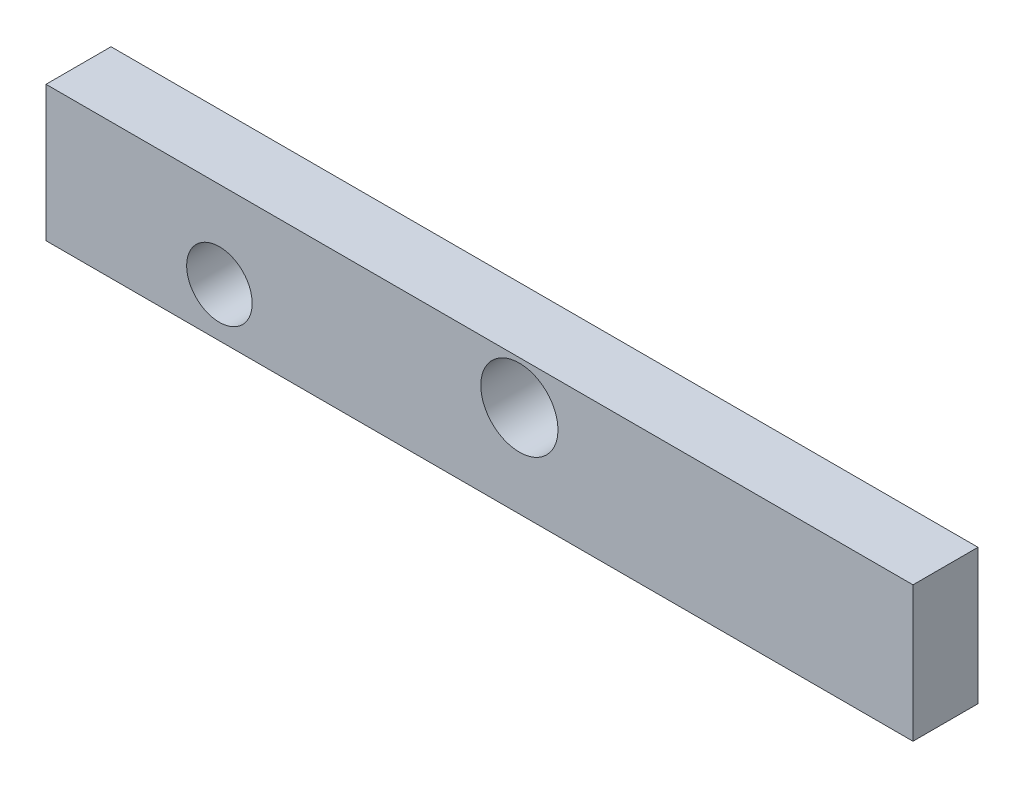
ISO-10303-21;
HEADER;
FILE_DESCRIPTION(('STEP AP214'),'2;1');
FILE_NAME('part.step','',(''),(''),'','','');
FILE_SCHEMA(('AUTOMOTIVE_DESIGN { 1 0 10303 214 1 1 1 1 }'));
ENDSEC;
DATA;
#1=APPLICATION_CONTEXT('core data for automotive mechanical design processes');
#2=APPLICATION_PROTOCOL_DEFINITION('international standard','automotive_design',2000,#1);
#3=PRODUCT_CONTEXT('',#1,'mechanical');
#4=PRODUCT('Part','Part','',(#3));
#5=PRODUCT_RELATED_PRODUCT_CATEGORY('part','',(#4));
#6=PRODUCT_DEFINITION_FORMATION('','',#4);
#7=PRODUCT_DEFINITION_CONTEXT('part definition',#1,'design');
#8=PRODUCT_DEFINITION('design','',#6,#7);
#9=PRODUCT_DEFINITION_SHAPE('','',#8);
#10=(LENGTH_UNIT() NAMED_UNIT(*) SI_UNIT(.MILLI.,.METRE.));
#11=(NAMED_UNIT(*) PLANE_ANGLE_UNIT() SI_UNIT($,.RADIAN.));
#12=(NAMED_UNIT(*) SI_UNIT($,.STERADIAN.) SOLID_ANGLE_UNIT());
#13=UNCERTAINTY_MEASURE_WITH_UNIT(LENGTH_MEASURE(1.E-05),#10,'distance_accuracy_value','');
#14=(GEOMETRIC_REPRESENTATION_CONTEXT(3) GLOBAL_UNCERTAINTY_ASSIGNED_CONTEXT((#13)) GLOBAL_UNIT_ASSIGNED_CONTEXT((#10,
#11,#12)) REPRESENTATION_CONTEXT('',''));
#15=CARTESIAN_POINT('',(0.,0.,0.));
#16=DIRECTION('',(0.,0.,1.));
#17=DIRECTION('',(1.,0.,0.));
#18=AXIS2_PLACEMENT_3D('',#15,#16,#17);
#19=CARTESIAN_POINT('',(-63.5,-22.225,9.525));
#20=DIRECTION('',(1.,0.,0.));
#21=DIRECTION('',(0.,0.,-1.));
#22=AXIS2_PLACEMENT_3D('',#19,#20,#21);
#23=PLANE('',#22);
#24=DIRECTION('',(0.,-1.,0.));
#25=VECTOR('',#24,1.);
#26=CARTESIAN_POINT('',(-63.5,-22.225,0.));
#27=LINE('',#26,#25);
#28=CARTESIAN_POINT('',(-63.5,22.225,0.));
#29=VERTEX_POINT('',#28);
#30=CARTESIAN_POINT('',(-63.5,2.3765268854373,0.));
#31=VERTEX_POINT('',#30);
#32=EDGE_CURVE('E87',#29,#31,#27,.T.);
#33=ORIENTED_EDGE('',*,*,#32,.T.);
#34=DIRECTION('',(0.,0.,-1.));
#35=VECTOR('',#34,1.);
#36=CARTESIAN_POINT('',(-63.5,2.3765268854373,9.525));
#37=LINE('',#36,#35);
#38=CARTESIAN_POINT('',(-63.5,2.3765268854373,9.525));
#39=VERTEX_POINT('',#38);
#40=EDGE_CURVE('E53',#39,#31,#37,.T.);
#41=ORIENTED_EDGE('',*,*,#40,.F.);
#42=DIRECTION('',(0.,-1.,0.));
#43=VECTOR('',#42,1.);
#44=CARTESIAN_POINT('',(-63.5,-22.225,9.525));
#45=LINE('',#44,#43);
#46=CARTESIAN_POINT('',(-63.5,22.225,9.525));
#47=VERTEX_POINT('',#46);
#48=EDGE_CURVE('E82',#47,#39,#45,.T.);
#49=ORIENTED_EDGE('',*,*,#48,.F.);
#50=DIRECTION('',(0.,0.,-1.));
#51=VECTOR('',#50,1.);
#52=CARTESIAN_POINT('',(-63.5,22.225,9.525));
#53=LINE('',#52,#51);
#54=EDGE_CURVE('E46',#47,#29,#53,.T.);
#55=ORIENTED_EDGE('',*,*,#54,.T.);
#56=EDGE_LOOP('',(#33,#41,#49,#55));
#57=FACE_BOUND('',#56,.T.);
#58=ADVANCED_FACE('F39',(#57),#23,.F.);
#59=CARTESIAN_POINT('',(63.5,-22.225,9.525));
#60=DIRECTION('',(-1.,0.,0.));
#61=DIRECTION('',(0.,0.,1.));
#62=AXIS2_PLACEMENT_3D('',#59,#60,#61);
#63=PLANE('',#62);
#64=DIRECTION('',(0.,1.,0.));
#65=VECTOR('',#64,1.);
#66=CARTESIAN_POINT('',(63.5,-22.225,9.525));
#67=LINE('',#66,#65);
#68=CARTESIAN_POINT('',(63.5,2.3765268854373,9.525));
#69=VERTEX_POINT('',#68);
#70=CARTESIAN_POINT('',(63.5,22.225,9.525));
#71=VERTEX_POINT('',#70);
#72=EDGE_CURVE('E98',#69,#71,#67,.T.);
#73=ORIENTED_EDGE('',*,*,#72,.F.);
#74=DIRECTION('',(0.,0.,-1.));
#75=VECTOR('',#74,1.);
#76=CARTESIAN_POINT('',(63.5,2.3765268854373,9.525));
#77=LINE('',#76,#75);
#78=CARTESIAN_POINT('',(63.5,2.3765268854373,0.));
#79=VERTEX_POINT('',#78);
#80=EDGE_CURVE('E102',#69,#79,#77,.T.);
#81=ORIENTED_EDGE('',*,*,#80,.T.);
#82=DIRECTION('',(0.,1.,0.));
#83=VECTOR('',#82,1.);
#84=CARTESIAN_POINT('',(63.5,-22.225,0.));
#85=LINE('',#84,#83);
#86=CARTESIAN_POINT('',(63.5,22.225,0.));
#87=VERTEX_POINT('',#86);
#88=EDGE_CURVE('E83',#79,#87,#85,.T.);
#89=ORIENTED_EDGE('',*,*,#88,.T.);
#90=DIRECTION('',(0.,0.,-1.));
#91=VECTOR('',#90,1.);
#92=CARTESIAN_POINT('',(63.5,22.225,9.525));
#93=LINE('',#92,#91);
#94=EDGE_CURVE('E11',#71,#87,#93,.T.);
#95=ORIENTED_EDGE('',*,*,#94,.F.);
#96=EDGE_LOOP('',(#73,#81,#89,#95));
#97=FACE_BOUND('',#96,.T.);
#98=ADVANCED_FACE('F143',(#97),#63,.F.);
#99=CARTESIAN_POINT('',(63.5,22.225,9.525));
#100=DIRECTION('',(0.,-1.,0.));
#101=DIRECTION('',(1.,0.,0.));
#102=AXIS2_PLACEMENT_3D('',#99,#100,#101);
#103=PLANE('',#102);
#104=DIRECTION('',(-1.,0.,0.));
#105=VECTOR('',#104,1.);
#106=CARTESIAN_POINT('',(63.5,22.225,0.));
#107=LINE('',#106,#105);
#108=EDGE_CURVE('E74',#87,#29,#107,.T.);
#109=ORIENTED_EDGE('',*,*,#108,.T.);
#110=ORIENTED_EDGE('',*,*,#54,.F.);
#111=DIRECTION('',(-1.,0.,0.));
#112=VECTOR('',#111,1.);
#113=CARTESIAN_POINT('',(63.5,22.225,9.525));
#114=LINE('',#113,#112);
#115=EDGE_CURVE('E62',#71,#47,#114,.T.);
#116=ORIENTED_EDGE('',*,*,#115,.F.);
#117=ORIENTED_EDGE('',*,*,#94,.T.);
#118=EDGE_LOOP('',(#109,#110,#116,#117));
#119=FACE_BOUND('',#118,.T.);
#120=ADVANCED_FACE('F76',(#119),#103,.F.);
#121=CARTESIAN_POINT('',(0.,0.,9.525));
#122=DIRECTION('',(0.,0.,1.));
#123=DIRECTION('',(1.,0.,0.));
#124=AXIS2_PLACEMENT_3D('',#121,#122,#123);
#125=PLANE('',#124);
#126=CARTESIAN_POINT('',(5.842,15.875,9.525));
#127=DIRECTION('',(0.,0.,-1.));
#128=DIRECTION('',(-1.,0.,0.));
#129=AXIS2_PLACEMENT_3D('',#126,#127,#128);
#130=CIRCLE('',#129,5.65212182349559);
#131=CARTESIAN_POINT('',(0.189878176504406,15.875,9.525));
#132=VERTEX_POINT('',#131);
#133=EDGE_CURVE('E109',#132,#132,#130,.T.);
#134=ORIENTED_EDGE('',*,*,#133,.T.);
#135=EDGE_LOOP('',(#134));
#136=FACE_BOUND('',#135,.T.);
#137=DIRECTION('',(1.,0.,0.));
#138=VECTOR('',#137,1.);
#139=CARTESIAN_POINT('',(63.5,2.3765268854373,9.525));
#140=LINE('',#139,#138);
#141=EDGE_CURVE('E105',#39,#69,#140,.T.);
#142=ORIENTED_EDGE('',*,*,#141,.T.);
#143=ORIENTED_EDGE('',*,*,#72,.T.);
#144=ORIENTED_EDGE('',*,*,#115,.T.);
#145=ORIENTED_EDGE('',*,*,#48,.T.);
#146=EDGE_LOOP('',(#142,#143,#144,#145));
#147=FACE_BOUND('',#146,.T.);
#148=CARTESIAN_POINT('',(-38.1,9.52500000000001,9.525));
#149=DIRECTION('',(0.,0.,1.));
#150=DIRECTION('',(1.,0.,0.));
#151=AXIS2_PLACEMENT_3D('',#148,#149,#150);
#152=CIRCLE('',#151,4.8);
#153=CARTESIAN_POINT('',(-42.9,9.52500000000001,9.525));
#154=VERTEX_POINT('',#153);
#155=EDGE_CURVE('E90',#154,#154,#152,.T.);
#156=ORIENTED_EDGE('',*,*,#155,.F.);
#157=EDGE_LOOP('',(#156));
#158=FACE_BOUND('',#157,.T.);
#159=ADVANCED_FACE('F118',(#136,#147,#158),#125,.T.);
#160=CARTESIAN_POINT('',(0.,0.,0.));
#161=DIRECTION('',(0.,0.,1.));
#162=DIRECTION('',(1.,0.,0.));
#163=AXIS2_PLACEMENT_3D('',#160,#161,#162);
#164=PLANE('',#163);
#165=CARTESIAN_POINT('',(5.842,15.875,0.));
#166=DIRECTION('',(0.,0.,-1.));
#167=DIRECTION('',(-1.,0.,0.));
#168=AXIS2_PLACEMENT_3D('',#165,#166,#167);
#169=CIRCLE('',#168,5.65212182349559);
#170=CARTESIAN_POINT('',(0.189878176504406,15.875,0.));
#171=VERTEX_POINT('',#170);
#172=EDGE_CURVE('E112',#171,#171,#169,.T.);
#173=ORIENTED_EDGE('',*,*,#172,.F.);
#174=EDGE_LOOP('',(#173));
#175=FACE_BOUND('',#174,.T.);
#176=CARTESIAN_POINT('',(-38.1,9.52500000000001,0.));
#177=DIRECTION('',(0.,0.,1.));
#178=DIRECTION('',(1.,0.,0.));
#179=AXIS2_PLACEMENT_3D('',#176,#177,#178);
#180=CIRCLE('',#179,4.8);
#181=CARTESIAN_POINT('',(-42.9,9.52500000000001,0.));
#182=VERTEX_POINT('',#181);
#183=EDGE_CURVE('E94',#182,#182,#180,.T.);
#184=ORIENTED_EDGE('',*,*,#183,.T.);
#185=EDGE_LOOP('',(#184));
#186=FACE_BOUND('',#185,.T.);
#187=ORIENTED_EDGE('',*,*,#88,.F.);
#188=DIRECTION('',(1.,0.,0.));
#189=VECTOR('',#188,1.);
#190=CARTESIAN_POINT('',(63.5,2.3765268854373,0.));
#191=LINE('',#190,#189);
#192=EDGE_CURVE('E89',#31,#79,#191,.T.);
#193=ORIENTED_EDGE('',*,*,#192,.F.);
#194=ORIENTED_EDGE('',*,*,#32,.F.);
#195=ORIENTED_EDGE('',*,*,#108,.F.);
#196=EDGE_LOOP('',(#187,#193,#194,#195));
#197=FACE_BOUND('',#196,.T.);
#198=ADVANCED_FACE('F88',(#175,#186,#197),#164,.F.);
#199=CARTESIAN_POINT('',(-38.1,9.52500000000001,9.525));
#200=DIRECTION('',(0.,0.,-1.));
#201=DIRECTION('',(-1.,0.,0.));
#202=AXIS2_PLACEMENT_3D('',#199,#200,#201);
#203=CYLINDRICAL_SURFACE('',#202,4.8);
#204=CARTESIAN_POINT('',(-42.9,9.52500000000001,9.525));
#205=CARTESIAN_POINT('',(-42.9,9.52500000000001,9.42578125));
#206=CARTESIAN_POINT('',(-42.9,9.52500000000001,9.3265625));
#207=CARTESIAN_POINT('',(-42.9,9.52500000000001,9.128125));
#208=CARTESIAN_POINT('',(-42.9,9.52500000000001,9.02890625));
#209=CARTESIAN_POINT('',(-42.9,9.52500000000001,8.83046875));
#210=CARTESIAN_POINT('',(-42.9,9.52500000000001,8.73125));
#211=CARTESIAN_POINT('',(-42.9,9.52500000000001,8.5328125));
#212=CARTESIAN_POINT('',(-42.9,9.52500000000001,8.43359375));
#213=CARTESIAN_POINT('',(-42.9,9.52500000000001,8.23515625));
#214=CARTESIAN_POINT('',(-42.9,9.52500000000001,8.1359375));
#215=CARTESIAN_POINT('',(-42.9,9.52500000000001,7.9375));
#216=CARTESIAN_POINT('',(-42.9,9.52500000000001,7.83828125));
#217=CARTESIAN_POINT('',(-42.9,9.52500000000001,7.63984375));
#218=CARTESIAN_POINT('',(-42.9,9.52500000000001,7.540625));
#219=CARTESIAN_POINT('',(-42.9,9.52500000000001,7.3421875));
#220=CARTESIAN_POINT('',(-42.9,9.52500000000001,7.24296875));
#221=CARTESIAN_POINT('',(-42.9,9.52500000000001,7.04453125));
#222=CARTESIAN_POINT('',(-42.9,9.52500000000001,6.9453125));
#223=CARTESIAN_POINT('',(-42.9,9.52500000000001,6.746875));
#224=CARTESIAN_POINT('',(-42.9,9.52500000000001,6.64765625));
#225=CARTESIAN_POINT('',(-42.9,9.52500000000001,6.44921875));
#226=CARTESIAN_POINT('',(-42.9,9.52500000000001,6.35));
#227=CARTESIAN_POINT('',(-42.9,9.52500000000001,6.1515625));
#228=CARTESIAN_POINT('',(-42.9,9.52500000000001,6.05234375));
#229=CARTESIAN_POINT('',(-42.9,9.52500000000001,5.85390625));
#230=CARTESIAN_POINT('',(-42.9,9.52500000000001,5.7546875));
#231=CARTESIAN_POINT('',(-42.9,9.52500000000001,5.55625));
#232=CARTESIAN_POINT('',(-42.9,9.52500000000001,5.45703125));
#233=CARTESIAN_POINT('',(-42.9,9.52500000000001,5.25859375));
#234=CARTESIAN_POINT('',(-42.9,9.52500000000001,5.159375));
#235=CARTESIAN_POINT('',(-42.9,9.52500000000001,4.9609375));
#236=CARTESIAN_POINT('',(-42.9,9.52500000000001,4.86171875));
#237=CARTESIAN_POINT('',(-42.9,9.52500000000001,4.66328125));
#238=CARTESIAN_POINT('',(-42.9,9.52500000000001,4.5640625));
#239=CARTESIAN_POINT('',(-42.9,9.52500000000001,4.365625));
#240=CARTESIAN_POINT('',(-42.9,9.52500000000001,4.26640625));
#241=CARTESIAN_POINT('',(-42.9,9.52500000000001,4.06796875));
#242=CARTESIAN_POINT('',(-42.9,9.52500000000001,3.96875));
#243=CARTESIAN_POINT('',(-42.9,9.52500000000001,3.7703125));
#244=CARTESIAN_POINT('',(-42.9,9.52500000000001,3.67109375));
#245=CARTESIAN_POINT('',(-42.9,9.52500000000001,3.47265625));
#246=CARTESIAN_POINT('',(-42.9,9.52500000000001,3.3734375));
#247=CARTESIAN_POINT('',(-42.9,9.52500000000001,3.175));
#248=CARTESIAN_POINT('',(-42.9,9.52500000000001,3.07578125));
#249=CARTESIAN_POINT('',(-42.9,9.52500000000001,2.87734375));
#250=CARTESIAN_POINT('',(-42.9,9.52500000000001,2.778125));
#251=CARTESIAN_POINT('',(-42.9,9.52500000000001,2.5796875));
#252=CARTESIAN_POINT('',(-42.9,9.52500000000001,2.48046875));
#253=CARTESIAN_POINT('',(-42.9,9.52500000000001,2.28203125));
#254=CARTESIAN_POINT('',(-42.9,9.52500000000001,2.1828125));
#255=CARTESIAN_POINT('',(-42.9,9.52500000000001,1.984375));
#256=CARTESIAN_POINT('',(-42.9,9.52500000000001,1.88515625));
#257=CARTESIAN_POINT('',(-42.9,9.52500000000001,1.68671875));
#258=CARTESIAN_POINT('',(-42.9,9.52500000000001,1.5875));
#259=CARTESIAN_POINT('',(-42.9,9.52500000000001,1.3890625));
#260=CARTESIAN_POINT('',(-42.9,9.52500000000001,1.28984375));
#261=CARTESIAN_POINT('',(-42.9,9.52500000000001,1.09140625));
#262=CARTESIAN_POINT('',(-42.9,9.52500000000001,0.992187500000001));
#263=CARTESIAN_POINT('',(-42.9,9.52500000000001,0.793750000000001));
#264=CARTESIAN_POINT('',(-42.9,9.52500000000001,0.69453125));
#265=CARTESIAN_POINT('',(-42.9,9.52500000000001,0.49609375));
#266=CARTESIAN_POINT('',(-42.9,9.52500000000001,0.396875));
#267=CARTESIAN_POINT('',(-42.9,9.52500000000001,0.1984375));
#268=CARTESIAN_POINT('',(-42.9,9.52500000000001,0.0992187500000001));
#269=CARTESIAN_POINT('',(-42.9,9.52500000000001,0.));
#270=B_SPLINE_CURVE_WITH_KNOTS('',3,(#204,#205,#206,#207,#208,#209,#210,#211,#212,#213,#214,
#215,#216,#217,#218,#219,#220,#221,#222,#223,#224,#225,#226,#227,#228,#229,#230,#231,#232,#233,
#234,#235,#236,#237,#238,#239,#240,#241,#242,#243,#244,#245,#246,#247,#248,#249,#250,#251,#252,
#253,#254,#255,#256,#257,#258,#259,#260,#261,#262,#263,#264,#265,#266,#267,#268,#269),
.UNSPECIFIED.,.F.,.F.,(4,2,2,2,2,2,2,2,2,2,2,2,2,2,2,2,2,2,2,2,2,2,2,2,2,2,2,2,2,2,2,2,4),(0.,
0.29765625,0.5953125,0.892968750000001,1.190625,1.48828125,1.7859375,2.08359375,2.38125,
2.67890625,2.9765625,3.27421875,3.571875,3.86953125,4.1671875,4.46484375,4.7625,5.06015625,
5.3578125,5.65546875,5.953125,6.25078125,6.5484375,6.84609375,7.14375,7.44140625,7.7390625,
8.03671875,8.334375,8.63203125,8.9296875,9.22734375,9.525),.UNSPECIFIED.);
#271=EDGE_CURVE('BSEAM129',#154,#182,#270,.T.);
#272=ORIENTED_EDGE('',*,*,#155,.T.);
#273=ORIENTED_EDGE('',*,*,#183,.F.);
#274=ORIENTED_EDGE('',*,*,#271,.T.);
#275=ORIENTED_EDGE('',*,*,#271,.F.);
#276=EDGE_LOOP('',(#272,#274,#273,#275));
#277=FACE_BOUND('',#276,.T.);
#278=ADVANCED_FACE('F129',(#277),#203,.F.);
#279=CARTESIAN_POINT('',(63.5,2.3765268854373,9.525));
#280=DIRECTION('',(0.,1.,0.));
#281=DIRECTION('',(0.,0.,1.));
#282=AXIS2_PLACEMENT_3D('',#279,#280,#281);
#283=PLANE('',#282);
#284=ORIENTED_EDGE('',*,*,#192,.T.);
#285=ORIENTED_EDGE('',*,*,#80,.F.);
#286=ORIENTED_EDGE('',*,*,#141,.F.);
#287=ORIENTED_EDGE('',*,*,#40,.T.);
#288=EDGE_LOOP('',(#284,#285,#286,#287));
#289=FACE_BOUND('',#288,.T.);
#290=ADVANCED_FACE('F123',(#289),#283,.F.);
#291=CARTESIAN_POINT('',(5.842,15.875,9.525));
#292=DIRECTION('',(0.,0.,-1.));
#293=DIRECTION('',(-1.,0.,0.));
#294=AXIS2_PLACEMENT_3D('',#291,#292,#293);
#295=CYLINDRICAL_SURFACE('',#294,5.65212182349559);
#296=CARTESIAN_POINT('',(0.189878176504406,15.875,9.525));
#297=CARTESIAN_POINT('',(0.189878176504406,15.875,9.42578125));
#298=CARTESIAN_POINT('',(0.189878176504406,15.875,9.3265625));
#299=CARTESIAN_POINT('',(0.189878176504406,15.875,9.128125));
#300=CARTESIAN_POINT('',(0.189878176504406,15.875,9.02890625));
#301=CARTESIAN_POINT('',(0.189878176504406,15.875,8.83046875));
#302=CARTESIAN_POINT('',(0.189878176504406,15.875,8.73125));
#303=CARTESIAN_POINT('',(0.189878176504406,15.875,8.5328125));
#304=CARTESIAN_POINT('',(0.189878176504406,15.875,8.43359375));
#305=CARTESIAN_POINT('',(0.189878176504406,15.875,8.23515625));
#306=CARTESIAN_POINT('',(0.189878176504406,15.875,8.1359375));
#307=CARTESIAN_POINT('',(0.189878176504406,15.875,7.9375));
#308=CARTESIAN_POINT('',(0.189878176504406,15.875,7.83828125));
#309=CARTESIAN_POINT('',(0.189878176504406,15.875,7.63984375));
#310=CARTESIAN_POINT('',(0.189878176504406,15.875,7.540625));
#311=CARTESIAN_POINT('',(0.189878176504406,15.875,7.3421875));
#312=CARTESIAN_POINT('',(0.189878176504406,15.875,7.24296875));
#313=CARTESIAN_POINT('',(0.189878176504406,15.875,7.04453125));
#314=CARTESIAN_POINT('',(0.189878176504406,15.875,6.9453125));
#315=CARTESIAN_POINT('',(0.189878176504406,15.875,6.746875));
#316=CARTESIAN_POINT('',(0.189878176504406,15.875,6.64765625));
#317=CARTESIAN_POINT('',(0.189878176504406,15.875,6.44921875));
#318=CARTESIAN_POINT('',(0.189878176504406,15.875,6.35));
#319=CARTESIAN_POINT('',(0.189878176504406,15.875,6.1515625));
#320=CARTESIAN_POINT('',(0.189878176504406,15.875,6.05234375));
#321=CARTESIAN_POINT('',(0.189878176504406,15.875,5.85390625));
#322=CARTESIAN_POINT('',(0.189878176504406,15.875,5.7546875));
#323=CARTESIAN_POINT('',(0.189878176504406,15.875,5.55625));
#324=CARTESIAN_POINT('',(0.189878176504406,15.875,5.45703125));
#325=CARTESIAN_POINT('',(0.189878176504406,15.875,5.25859375));
#326=CARTESIAN_POINT('',(0.189878176504406,15.875,5.159375));
#327=CARTESIAN_POINT('',(0.189878176504406,15.875,4.9609375));
#328=CARTESIAN_POINT('',(0.189878176504406,15.875,4.86171875));
#329=CARTESIAN_POINT('',(0.189878176504406,15.875,4.66328125));
#330=CARTESIAN_POINT('',(0.189878176504406,15.875,4.5640625));
#331=CARTESIAN_POINT('',(0.189878176504406,15.875,4.365625));
#332=CARTESIAN_POINT('',(0.189878176504406,15.875,4.26640625));
#333=CARTESIAN_POINT('',(0.189878176504406,15.875,4.06796875));
#334=CARTESIAN_POINT('',(0.189878176504406,15.875,3.96875));
#335=CARTESIAN_POINT('',(0.189878176504406,15.875,3.7703125));
#336=CARTESIAN_POINT('',(0.189878176504406,15.875,3.67109375));
#337=CARTESIAN_POINT('',(0.189878176504406,15.875,3.47265625));
#338=CARTESIAN_POINT('',(0.189878176504406,15.875,3.3734375));
#339=CARTESIAN_POINT('',(0.189878176504406,15.875,3.175));
#340=CARTESIAN_POINT('',(0.189878176504406,15.875,3.07578125));
#341=CARTESIAN_POINT('',(0.189878176504406,15.875,2.87734375));
#342=CARTESIAN_POINT('',(0.189878176504406,15.875,2.778125));
#343=CARTESIAN_POINT('',(0.189878176504406,15.875,2.5796875));
#344=CARTESIAN_POINT('',(0.189878176504406,15.875,2.48046875));
#345=CARTESIAN_POINT('',(0.189878176504406,15.875,2.28203125));
#346=CARTESIAN_POINT('',(0.189878176504406,15.875,2.1828125));
#347=CARTESIAN_POINT('',(0.189878176504406,15.875,1.984375));
#348=CARTESIAN_POINT('',(0.189878176504406,15.875,1.88515625));
#349=CARTESIAN_POINT('',(0.189878176504406,15.875,1.68671875));
#350=CARTESIAN_POINT('',(0.189878176504406,15.875,1.5875));
#351=CARTESIAN_POINT('',(0.189878176504406,15.875,1.3890625));
#352=CARTESIAN_POINT('',(0.189878176504406,15.875,1.28984375));
#353=CARTESIAN_POINT('',(0.189878176504406,15.875,1.09140625));
#354=CARTESIAN_POINT('',(0.189878176504406,15.875,0.992187500000001));
#355=CARTESIAN_POINT('',(0.189878176504406,15.875,0.793750000000001));
#356=CARTESIAN_POINT('',(0.189878176504406,15.875,0.69453125));
#357=CARTESIAN_POINT('',(0.189878176504406,15.875,0.49609375));
#358=CARTESIAN_POINT('',(0.189878176504406,15.875,0.396875));
#359=CARTESIAN_POINT('',(0.189878176504406,15.875,0.1984375));
#360=CARTESIAN_POINT('',(0.189878176504406,15.875,0.0992187500000001));
#361=CARTESIAN_POINT('',(0.189878176504406,15.875,0.));
#362=B_SPLINE_CURVE_WITH_KNOTS('',3,(#296,#297,#298,#299,#300,#301,#302,#303,#304,#305,#306,
#307,#308,#309,#310,#311,#312,#313,#314,#315,#316,#317,#318,#319,#320,#321,#322,#323,#324,#325,
#326,#327,#328,#329,#330,#331,#332,#333,#334,#335,#336,#337,#338,#339,#340,#341,#342,#343,#344,
#345,#346,#347,#348,#349,#350,#351,#352,#353,#354,#355,#356,#357,#358,#359,#360,#361),
.UNSPECIFIED.,.F.,.F.,(4,2,2,2,2,2,2,2,2,2,2,2,2,2,2,2,2,2,2,2,2,2,2,2,2,2,2,2,2,2,2,2,4),(0.,
0.29765625,0.5953125,0.892968750000001,1.190625,1.48828125,1.7859375,2.08359375,2.38125,
2.67890625,2.9765625,3.27421875,3.571875,3.86953125,4.1671875,4.46484375,4.7625,5.06015625,
5.3578125,5.65546875,5.953125,6.25078125,6.5484375,6.84609375,7.14375,7.44140625,7.7390625,
8.03671875,8.334375,8.63203125,8.9296875,9.22734375,9.525),.UNSPECIFIED.);
#363=EDGE_CURVE('BSEAM120',#132,#171,#362,.T.);
#364=ORIENTED_EDGE('',*,*,#133,.F.);
#365=ORIENTED_EDGE('',*,*,#172,.T.);
#366=ORIENTED_EDGE('',*,*,#363,.T.);
#367=ORIENTED_EDGE('',*,*,#363,.F.);
#368=EDGE_LOOP('',(#364,#366,#365,#367));
#369=FACE_BOUND('',#368,.T.);
#370=ADVANCED_FACE('F120',(#369),#295,.F.);
#371=CLOSED_SHELL('',(#58,#98,#120,#159,#198,#278,#290,#370));
#372=MANIFOLD_SOLID_BREP('B2',#371);
#373=ADVANCED_BREP_SHAPE_REPRESENTATION('',(#18,#372),#14);
#374=SHAPE_DEFINITION_REPRESENTATION(#9,#373);
ENDSEC;
END-ISO-10303-21;
